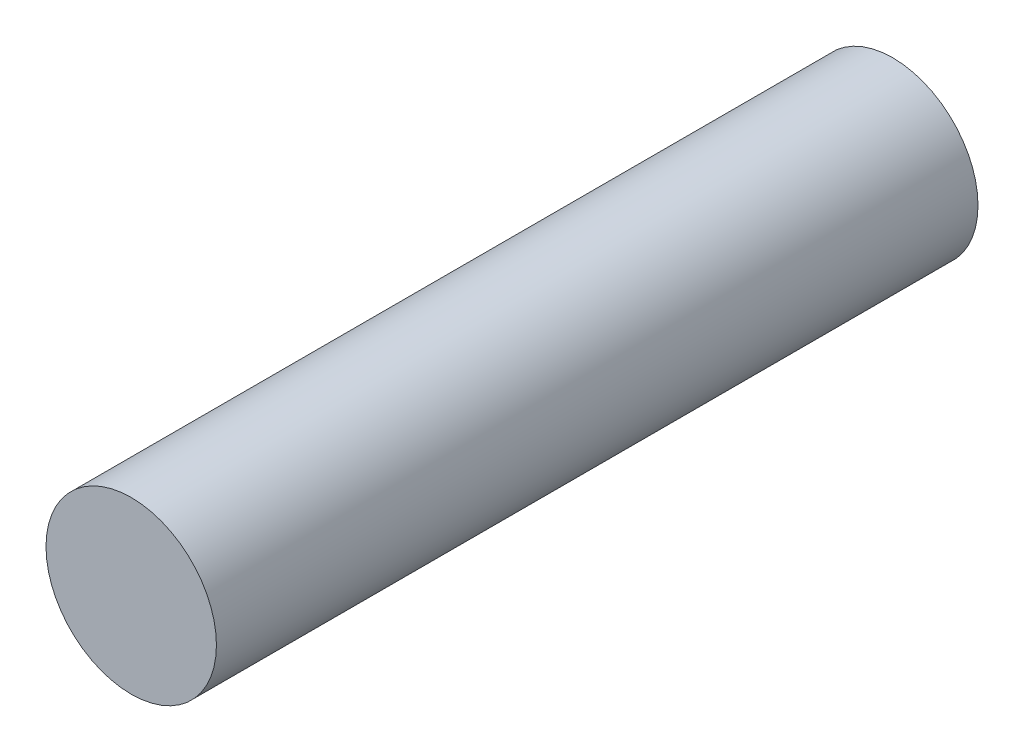
ISO-10303-21;
HEADER;
FILE_DESCRIPTION(('STEP AP214'),'2;1');
FILE_NAME('part.step','',(''),(''),'','','');
FILE_SCHEMA(('AUTOMOTIVE_DESIGN { 1 0 10303 214 1 1 1 1 }'));
ENDSEC;
DATA;
#1=APPLICATION_CONTEXT('core data for automotive mechanical design processes');
#2=APPLICATION_PROTOCOL_DEFINITION('international standard','automotive_design',2000,#1);
#3=PRODUCT_CONTEXT('',#1,'mechanical');
#4=PRODUCT('Part','Part','',(#3));
#5=PRODUCT_RELATED_PRODUCT_CATEGORY('part','',(#4));
#6=PRODUCT_DEFINITION_FORMATION('','',#4);
#7=PRODUCT_DEFINITION_CONTEXT('part definition',#1,'design');
#8=PRODUCT_DEFINITION('design','',#6,#7);
#9=PRODUCT_DEFINITION_SHAPE('','',#8);
#10=(LENGTH_UNIT() NAMED_UNIT(*) SI_UNIT(.MILLI.,.METRE.));
#11=(NAMED_UNIT(*) PLANE_ANGLE_UNIT() SI_UNIT($,.RADIAN.));
#12=(NAMED_UNIT(*) SI_UNIT($,.STERADIAN.) SOLID_ANGLE_UNIT());
#13=UNCERTAINTY_MEASURE_WITH_UNIT(LENGTH_MEASURE(1.E-05),#10,'distance_accuracy_value','');
#14=(GEOMETRIC_REPRESENTATION_CONTEXT(3) GLOBAL_UNCERTAINTY_ASSIGNED_CONTEXT((#13)) GLOBAL_UNIT_ASSIGNED_CONTEXT((#10,
#11,#12)) REPRESENTATION_CONTEXT('',''));
#15=CARTESIAN_POINT('',(0.,0.,0.));
#16=DIRECTION('',(0.,0.,1.));
#17=DIRECTION('',(1.,0.,0.));
#18=AXIS2_PLACEMENT_3D('',#15,#16,#17);
#19=CARTESIAN_POINT('',(0.,0.,24.13));
#20=DIRECTION('',(0.,0.,-1.));
#21=DIRECTION('',(-1.,0.,0.));
#22=AXIS2_PLACEMENT_3D('',#19,#20,#21);
#23=CYLINDRICAL_SURFACE('',#22,2.7);
#24=CARTESIAN_POINT('',(0.,0.,24.13));
#25=DIRECTION('',(0.,0.,1.));
#26=DIRECTION('',(1.,0.,0.));
#27=AXIS2_PLACEMENT_3D('',#24,#25,#26);
#28=CIRCLE('',#27,2.7);
#29=CARTESIAN_POINT('',(-2.7,0.,24.13));
#30=VERTEX_POINT('',#29);
#31=EDGE_CURVE('E10',#30,#30,#28,.T.);
#32=CARTESIAN_POINT('',(0.,0.,0.));
#33=DIRECTION('',(0.,0.,1.));
#34=DIRECTION('',(1.,0.,0.));
#35=AXIS2_PLACEMENT_3D('',#32,#33,#34);
#36=CIRCLE('',#35,2.7);
#37=CARTESIAN_POINT('',(-2.7,0.,0.));
#38=VERTEX_POINT('',#37);
#39=EDGE_CURVE('E35',#38,#38,#36,.T.);
#40=CARTESIAN_POINT('',(-2.7,0.,24.13));
#41=CARTESIAN_POINT('',(-2.7,0.,23.8786458333333));
#42=CARTESIAN_POINT('',(-2.7,0.,23.6272916666667));
#43=CARTESIAN_POINT('',(-2.7,0.,23.1245833333333));
#44=CARTESIAN_POINT('',(-2.7,0.,22.8732291666667));
#45=CARTESIAN_POINT('',(-2.7,0.,22.3705208333333));
#46=CARTESIAN_POINT('',(-2.7,0.,22.1191666666667));
#47=CARTESIAN_POINT('',(-2.7,0.,21.6164583333333));
#48=CARTESIAN_POINT('',(-2.7,0.,21.3651041666667));
#49=CARTESIAN_POINT('',(-2.7,0.,20.8623958333333));
#50=CARTESIAN_POINT('',(-2.7,0.,20.6110416666667));
#51=CARTESIAN_POINT('',(-2.7,0.,20.1083333333333));
#52=CARTESIAN_POINT('',(-2.7,0.,19.8569791666667));
#53=CARTESIAN_POINT('',(-2.7,0.,19.3542708333333));
#54=CARTESIAN_POINT('',(-2.7,0.,19.1029166666667));
#55=CARTESIAN_POINT('',(-2.7,0.,18.6002083333333));
#56=CARTESIAN_POINT('',(-2.7,0.,18.3488541666667));
#57=CARTESIAN_POINT('',(-2.7,0.,17.8461458333333));
#58=CARTESIAN_POINT('',(-2.7,0.,17.5947916666667));
#59=CARTESIAN_POINT('',(-2.7,0.,17.0920833333333));
#60=CARTESIAN_POINT('',(-2.7,0.,16.8407291666667));
#61=CARTESIAN_POINT('',(-2.7,0.,16.3380208333333));
#62=CARTESIAN_POINT('',(-2.7,0.,16.0866666666667));
#63=CARTESIAN_POINT('',(-2.7,0.,15.5839583333333));
#64=CARTESIAN_POINT('',(-2.7,0.,15.3326041666667));
#65=CARTESIAN_POINT('',(-2.7,0.,14.8298958333333));
#66=CARTESIAN_POINT('',(-2.7,0.,14.5785416666667));
#67=CARTESIAN_POINT('',(-2.7,0.,14.0758333333333));
#68=CARTESIAN_POINT('',(-2.7,0.,13.8244791666667));
#69=CARTESIAN_POINT('',(-2.7,0.,13.3217708333333));
#70=CARTESIAN_POINT('',(-2.7,0.,13.0704166666667));
#71=CARTESIAN_POINT('',(-2.7,0.,12.5677083333333));
#72=CARTESIAN_POINT('',(-2.7,0.,12.3163541666667));
#73=CARTESIAN_POINT('',(-2.7,0.,11.8136458333333));
#74=CARTESIAN_POINT('',(-2.7,0.,11.5622916666667));
#75=CARTESIAN_POINT('',(-2.7,0.,11.0595833333333));
#76=CARTESIAN_POINT('',(-2.7,0.,10.8082291666667));
#77=CARTESIAN_POINT('',(-2.7,0.,10.3055208333333));
#78=CARTESIAN_POINT('',(-2.7,0.,10.0541666666667));
#79=CARTESIAN_POINT('',(-2.7,0.,9.55145833333333));
#80=CARTESIAN_POINT('',(-2.7,0.,9.30010416666667));
#81=CARTESIAN_POINT('',(-2.7,0.,8.79739583333333));
#82=CARTESIAN_POINT('',(-2.7,0.,8.54604166666667));
#83=CARTESIAN_POINT('',(-2.7,0.,8.04333333333333));
#84=CARTESIAN_POINT('',(-2.7,0.,7.79197916666666));
#85=CARTESIAN_POINT('',(-2.7,0.,7.28927083333333));
#86=CARTESIAN_POINT('',(-2.7,0.,7.03791666666666));
#87=CARTESIAN_POINT('',(-2.7,0.,6.53520833333333));
#88=CARTESIAN_POINT('',(-2.7,0.,6.28385416666666));
#89=CARTESIAN_POINT('',(-2.7,0.,5.78114583333333));
#90=CARTESIAN_POINT('',(-2.7,0.,5.52979166666666));
#91=CARTESIAN_POINT('',(-2.7,0.,5.02708333333333));
#92=CARTESIAN_POINT('',(-2.7,0.,4.77572916666666));
#93=CARTESIAN_POINT('',(-2.7,0.,4.27302083333333));
#94=CARTESIAN_POINT('',(-2.7,0.,4.02166666666666));
#95=CARTESIAN_POINT('',(-2.7,0.,3.51895833333333));
#96=CARTESIAN_POINT('',(-2.7,0.,3.26760416666666));
#97=CARTESIAN_POINT('',(-2.7,0.,2.76489583333333));
#98=CARTESIAN_POINT('',(-2.7,0.,2.51354166666666));
#99=CARTESIAN_POINT('',(-2.7,0.,2.01083333333333));
#100=CARTESIAN_POINT('',(-2.7,0.,1.75947916666666));
#101=CARTESIAN_POINT('',(-2.7,0.,1.25677083333333));
#102=CARTESIAN_POINT('',(-2.7,0.,1.00541666666666));
#103=CARTESIAN_POINT('',(-2.7,0.,0.50270833333333));
#104=CARTESIAN_POINT('',(-2.7,0.,0.251354166666663));
#105=CARTESIAN_POINT('',(-2.7,0.,0.));
#106=B_SPLINE_CURVE_WITH_KNOTS('',3,(#40,#41,#42,#43,#44,#45,#46,#47,#48,#49,#50,#51,#52,#53,
#54,#55,#56,#57,#58,#59,#60,#61,#62,#63,#64,#65,#66,#67,#68,#69,#70,#71,#72,#73,#74,#75,#76,#77,
#78,#79,#80,#81,#82,#83,#84,#85,#86,#87,#88,#89,#90,#91,#92,#93,#94,#95,#96,#97,#98,#99,#100,
#101,#102,#103,#104,#105),.UNSPECIFIED.,.F.,.F.,(4,2,2,2,2,2,2,2,2,2,2,2,2,2,2,2,2,2,2,2,2,2,2,
2,2,2,2,2,2,2,2,2,4),(0.,0.7540625,1.508125,2.2621875,3.01625,3.7703125,4.524375,5.2784375,
6.0325,6.7865625,7.540625,8.2946875,9.04875,9.8028125,10.556875,11.3109375,12.065,12.8190625,
13.573125,14.3271875,15.08125,15.8353125,16.589375,17.3434375,18.0975,18.8515625,19.605625,
20.3596875,21.11375,21.8678125,22.621875,23.3759375,24.13),.UNSPECIFIED.);
#107=EDGE_CURVE('BSEAM32',#30,#38,#106,.T.);
#108=ORIENTED_EDGE('',*,*,#31,.F.);
#109=ORIENTED_EDGE('',*,*,#39,.T.);
#110=ORIENTED_EDGE('',*,*,#107,.T.);
#111=ORIENTED_EDGE('',*,*,#107,.F.);
#112=EDGE_LOOP('',(#108,#110,#109,#111));
#113=FACE_BOUND('',#112,.T.);
#114=ADVANCED_FACE('F32',(#113),#23,.T.);
#115=CARTESIAN_POINT('',(0.,0.,24.13));
#116=DIRECTION('',(0.,0.,1.));
#117=DIRECTION('',(1.,0.,0.));
#118=AXIS2_PLACEMENT_3D('',#115,#116,#117);
#119=PLANE('',#118);
#120=ORIENTED_EDGE('',*,*,#31,.T.);
#121=EDGE_LOOP('',(#120));
#122=FACE_BOUND('',#121,.T.);
#123=ADVANCED_FACE('F47',(#122),#119,.T.);
#124=CARTESIAN_POINT('',(0.,0.,0.));
#125=DIRECTION('',(0.,0.,1.));
#126=DIRECTION('',(1.,0.,0.));
#127=AXIS2_PLACEMENT_3D('',#124,#125,#126);
#128=PLANE('',#127);
#129=ORIENTED_EDGE('',*,*,#39,.F.);
#130=EDGE_LOOP('',(#129));
#131=FACE_BOUND('',#130,.T.);
#132=ADVANCED_FACE('F45',(#131),#128,.F.);
#133=CLOSED_SHELL('',(#114,#123,#132));
#134=MANIFOLD_SOLID_BREP('B2',#133);
#135=ADVANCED_BREP_SHAPE_REPRESENTATION('',(#18,#134),#14);
#136=SHAPE_DEFINITION_REPRESENTATION(#9,#135);
ENDSEC;
END-ISO-10303-21;
